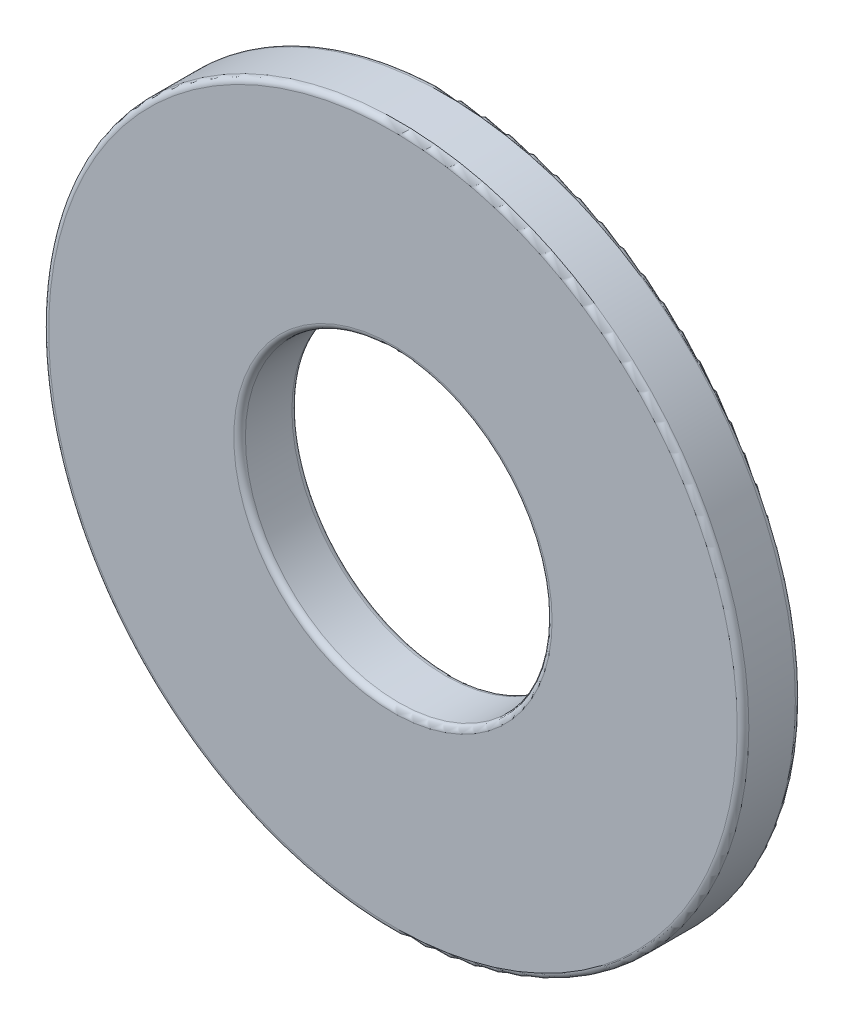
ISO-10303-21;
HEADER;
FILE_DESCRIPTION(('STEP AP214'),'2;1');
FILE_NAME('part.step','',(''),(''),'','','');
FILE_SCHEMA(('AUTOMOTIVE_DESIGN { 1 0 10303 214 1 1 1 1 }'));
ENDSEC;
DATA;
#1=APPLICATION_CONTEXT('core data for automotive mechanical design processes');
#2=APPLICATION_PROTOCOL_DEFINITION('international standard','automotive_design',2000,#1);
#3=PRODUCT_CONTEXT('',#1,'mechanical');
#4=PRODUCT('Part','Part','',(#3));
#5=PRODUCT_RELATED_PRODUCT_CATEGORY('part','',(#4));
#6=PRODUCT_DEFINITION_FORMATION('','',#4);
#7=PRODUCT_DEFINITION_CONTEXT('part definition',#1,'design');
#8=PRODUCT_DEFINITION('design','',#6,#7);
#9=PRODUCT_DEFINITION_SHAPE('','',#8);
#10=(LENGTH_UNIT() NAMED_UNIT(*) SI_UNIT(.MILLI.,.METRE.));
#11=(NAMED_UNIT(*) PLANE_ANGLE_UNIT() SI_UNIT($,.RADIAN.));
#12=(NAMED_UNIT(*) SI_UNIT($,.STERADIAN.) SOLID_ANGLE_UNIT());
#13=UNCERTAINTY_MEASURE_WITH_UNIT(LENGTH_MEASURE(1.E-05),#10,'distance_accuracy_value','');
#14=(GEOMETRIC_REPRESENTATION_CONTEXT(3) GLOBAL_UNCERTAINTY_ASSIGNED_CONTEXT((#13)) GLOBAL_UNIT_ASSIGNED_CONTEXT((#10,
#11,#12)) REPRESENTATION_CONTEXT('',''));
#15=CARTESIAN_POINT('',(0.,0.,0.));
#16=DIRECTION('',(0.,0.,1.));
#17=DIRECTION('',(1.,0.,0.));
#18=AXIS2_PLACEMENT_3D('',#15,#16,#17);
#19=CARTESIAN_POINT('',(0.,0.,-1.0541));
#20=DIRECTION('',(0.,0.,1.));
#21=DIRECTION('',(1.,0.,0.));
#22=AXIS2_PLACEMENT_3D('',#19,#20,#21);
#23=CYLINDRICAL_SURFACE('',#22,12.7);
#24=CARTESIAN_POINT('',(0.,0.,-0.84328));
#25=DIRECTION('',(0.,0.,1.));
#26=DIRECTION('',(1.,0.,0.));
#27=AXIS2_PLACEMENT_3D('',#24,#25,#26);
#28=CIRCLE('',#27,12.7);
#29=CARTESIAN_POINT('',(12.7,0.,-0.84328));
#30=VERTEX_POINT('',#29);
#31=EDGE_CURVE('E61',#30,#30,#28,.T.);
#32=ORIENTED_EDGE('',*,*,#31,.T.);
#33=EDGE_LOOP('',(#32));
#34=FACE_BOUND('',#33,.T.);
#35=CARTESIAN_POINT('',(0.,0.,0.84328));
#36=DIRECTION('',(0.,0.,1.));
#37=DIRECTION('',(1.,0.,0.));
#38=AXIS2_PLACEMENT_3D('',#35,#36,#37);
#39=CIRCLE('',#38,12.7);
#40=CARTESIAN_POINT('',(12.7,0.,0.84328));
#41=VERTEX_POINT('',#40);
#42=EDGE_CURVE('E64',#41,#41,#39,.F.);
#43=ORIENTED_EDGE('',*,*,#42,.T.);
#44=EDGE_LOOP('',(#43));
#45=FACE_BOUND('',#44,.T.);
#46=ADVANCED_FACE('F35',(#34,#45),#23,.T.);
#47=CARTESIAN_POINT('',(0.,0.,-1.0541));
#48=DIRECTION('',(0.,0.,1.));
#49=DIRECTION('',(1.,0.,0.));
#50=AXIS2_PLACEMENT_3D('',#47,#48,#49);
#51=PLANE('',#50);
#52=CARTESIAN_POINT('',(0.,0.,-1.0541));
#53=DIRECTION('',(0.,0.,1.));
#54=DIRECTION('',(1.,0.,0.));
#55=AXIS2_PLACEMENT_3D('',#52,#53,#54);
#56=CIRCLE('',#55,12.48918);
#57=CARTESIAN_POINT('',(12.48918,0.,-1.0541));
#58=VERTEX_POINT('',#57);
#59=EDGE_CURVE('E55',#58,#58,#56,.F.);
#60=ORIENTED_EDGE('',*,*,#59,.T.);
#61=EDGE_LOOP('',(#60));
#62=FACE_BOUND('',#61,.T.);
#63=CARTESIAN_POINT('',(0.,0.,-1.0541));
#64=DIRECTION('',(0.,0.,1.));
#65=DIRECTION('',(1.,0.,0.));
#66=AXIS2_PLACEMENT_3D('',#63,#64,#65);
#67=CIRCLE('',#66,5.77342);
#68=CARTESIAN_POINT('',(5.77342,0.,-1.0541));
#69=VERTEX_POINT('',#68);
#70=EDGE_CURVE('E58',#69,#69,#67,.T.);
#71=ORIENTED_EDGE('',*,*,#70,.T.);
#72=EDGE_LOOP('',(#71));
#73=FACE_BOUND('',#72,.T.);
#74=ADVANCED_FACE('F78',(#62,#73),#51,.F.);
#75=CARTESIAN_POINT('',(0.,0.,-1.0541));
#76=DIRECTION('',(0.,0.,1.));
#77=DIRECTION('',(1.,0.,0.));
#78=AXIS2_PLACEMENT_3D('',#75,#76,#77);
#79=CYLINDRICAL_SURFACE('',#78,5.5626);
#80=CARTESIAN_POINT('',(0.,0.,-0.84328));
#81=DIRECTION('',(0.,0.,1.));
#82=DIRECTION('',(1.,0.,0.));
#83=AXIS2_PLACEMENT_3D('',#80,#81,#82);
#84=CIRCLE('',#83,5.5626);
#85=CARTESIAN_POINT('',(5.5626,0.,-0.84328));
#86=VERTEX_POINT('',#85);
#87=EDGE_CURVE('E46',#86,#86,#84,.F.);
#88=ORIENTED_EDGE('',*,*,#87,.T.);
#89=EDGE_LOOP('',(#88));
#90=FACE_BOUND('',#89,.T.);
#91=CARTESIAN_POINT('',(0.,0.,0.84328));
#92=DIRECTION('',(0.,0.,1.));
#93=DIRECTION('',(1.,0.,0.));
#94=AXIS2_PLACEMENT_3D('',#91,#92,#93);
#95=CIRCLE('',#94,5.5626);
#96=CARTESIAN_POINT('',(5.5626,0.,0.84328));
#97=VERTEX_POINT('',#96);
#98=EDGE_CURVE('E50',#97,#97,#95,.T.);
#99=ORIENTED_EDGE('',*,*,#98,.T.);
#100=EDGE_LOOP('',(#99));
#101=FACE_BOUND('',#100,.T.);
#102=ADVANCED_FACE('F84',(#90,#101),#79,.F.);
#103=CARTESIAN_POINT('',(0.,0.,1.0541));
#104=DIRECTION('',(0.,0.,1.));
#105=DIRECTION('',(1.,0.,0.));
#106=AXIS2_PLACEMENT_3D('',#103,#104,#105);
#107=PLANE('',#106);
#108=CARTESIAN_POINT('',(0.,0.,1.0541));
#109=DIRECTION('',(0.,0.,1.));
#110=DIRECTION('',(1.,0.,0.));
#111=AXIS2_PLACEMENT_3D('',#108,#109,#110);
#112=CIRCLE('',#111,5.77342);
#113=CARTESIAN_POINT('',(5.77342,0.,1.0541));
#114=VERTEX_POINT('',#113);
#115=EDGE_CURVE('E10',#114,#114,#112,.F.);
#116=ORIENTED_EDGE('',*,*,#115,.T.);
#117=EDGE_LOOP('',(#116));
#118=FACE_BOUND('',#117,.T.);
#119=CARTESIAN_POINT('',(0.,0.,1.0541));
#120=DIRECTION('',(0.,0.,1.));
#121=DIRECTION('',(1.,0.,0.));
#122=AXIS2_PLACEMENT_3D('',#119,#120,#121);
#123=CIRCLE('',#122,12.48918);
#124=CARTESIAN_POINT('',(12.48918,0.,1.0541));
#125=VERTEX_POINT('',#124);
#126=EDGE_CURVE('E42',#125,#125,#123,.T.);
#127=ORIENTED_EDGE('',*,*,#126,.T.);
#128=EDGE_LOOP('',(#127));
#129=FACE_BOUND('',#128,.T.);
#130=ADVANCED_FACE('F92',(#118,#129),#107,.T.);
#131=CARTESIAN_POINT('',(0.,0.,-0.84328));
#132=DIRECTION('',(0.,0.,1.));
#133=DIRECTION('',(1.,0.,0.));
#134=AXIS2_PLACEMENT_3D('',#131,#132,#133);
#135=TOROIDAL_SURFACE('',#134,12.48918,0.21082);
#136=ORIENTED_EDGE('',*,*,#59,.F.);
#137=EDGE_LOOP('',(#136));
#138=FACE_BOUND('',#137,.T.);
#139=ORIENTED_EDGE('',*,*,#31,.F.);
#140=EDGE_LOOP('',(#139));
#141=FACE_BOUND('',#140,.T.);
#142=ADVANCED_FACE('F89',(#138,#141),#135,.T.);
#143=CARTESIAN_POINT('',(0.,0.,-0.84328));
#144=DIRECTION('',(0.,0.,1.));
#145=DIRECTION('',(1.,0.,0.));
#146=AXIS2_PLACEMENT_3D('',#143,#144,#145);
#147=TOROIDAL_SURFACE('',#146,5.77342,0.21082);
#148=ORIENTED_EDGE('',*,*,#87,.F.);
#149=EDGE_LOOP('',(#148));
#150=FACE_BOUND('',#149,.T.);
#151=ORIENTED_EDGE('',*,*,#70,.F.);
#152=EDGE_LOOP('',(#151));
#153=FACE_BOUND('',#152,.T.);
#154=ADVANCED_FACE('F75',(#150,#153),#147,.T.);
#155=CARTESIAN_POINT('',(0.,0.,0.84328));
#156=DIRECTION('',(0.,0.,1.));
#157=DIRECTION('',(1.,0.,0.));
#158=AXIS2_PLACEMENT_3D('',#155,#156,#157);
#159=TOROIDAL_SURFACE('',#158,5.77342,0.21082);
#160=ORIENTED_EDGE('',*,*,#115,.F.);
#161=EDGE_LOOP('',(#160));
#162=FACE_BOUND('',#161,.T.);
#163=ORIENTED_EDGE('',*,*,#98,.F.);
#164=EDGE_LOOP('',(#163));
#165=FACE_BOUND('',#164,.T.);
#166=ADVANCED_FACE('F71',(#162,#165),#159,.T.);
#167=CARTESIAN_POINT('',(0.,0.,0.84328));
#168=DIRECTION('',(0.,0.,1.));
#169=DIRECTION('',(1.,0.,0.));
#170=AXIS2_PLACEMENT_3D('',#167,#168,#169);
#171=TOROIDAL_SURFACE('',#170,12.48918,0.21082);
#172=ORIENTED_EDGE('',*,*,#42,.F.);
#173=EDGE_LOOP('',(#172));
#174=FACE_BOUND('',#173,.T.);
#175=ORIENTED_EDGE('',*,*,#126,.F.);
#176=EDGE_LOOP('',(#175));
#177=FACE_BOUND('',#176,.T.);
#178=ADVANCED_FACE('F37',(#174,#177),#171,.T.);
#179=CLOSED_SHELL('',(#46,#74,#102,#130,#142,#154,#166,#178));
#180=MANIFOLD_SOLID_BREP('B2',#179);
#181=ADVANCED_BREP_SHAPE_REPRESENTATION('',(#18,#180),#14);
#182=SHAPE_DEFINITION_REPRESENTATION(#9,#181);
ENDSEC;
END-ISO-10303-21;
